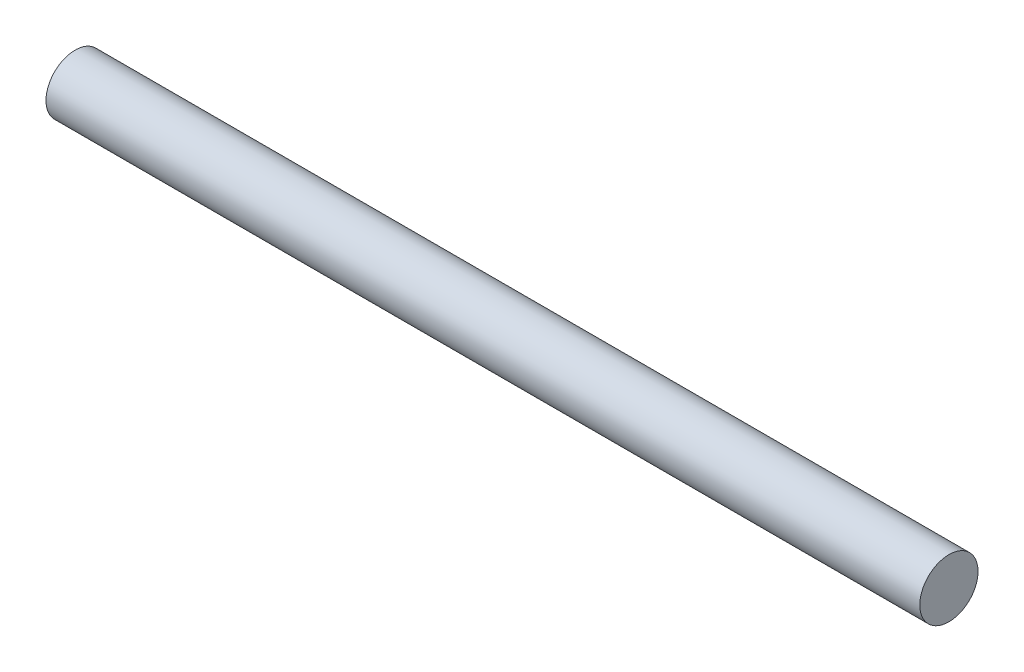
ISO-10303-21;
HEADER;
FILE_DESCRIPTION(('STEP AP214'),'2;1');
FILE_NAME('part.step','',(''),(''),'','','');
FILE_SCHEMA(('AUTOMOTIVE_DESIGN { 1 0 10303 214 1 1 1 1 }'));
ENDSEC;
DATA;
#1=APPLICATION_CONTEXT('core data for automotive mechanical design processes');
#2=APPLICATION_PROTOCOL_DEFINITION('international standard','automotive_design',2000,#1);
#3=PRODUCT_CONTEXT('',#1,'mechanical');
#4=PRODUCT('Part','Part','',(#3));
#5=PRODUCT_RELATED_PRODUCT_CATEGORY('part','',(#4));
#6=PRODUCT_DEFINITION_FORMATION('','',#4);
#7=PRODUCT_DEFINITION_CONTEXT('part definition',#1,'design');
#8=PRODUCT_DEFINITION('design','',#6,#7);
#9=PRODUCT_DEFINITION_SHAPE('','',#8);
#10=(LENGTH_UNIT() NAMED_UNIT(*) SI_UNIT(.MILLI.,.METRE.));
#11=(NAMED_UNIT(*) PLANE_ANGLE_UNIT() SI_UNIT($,.RADIAN.));
#12=(NAMED_UNIT(*) SI_UNIT($,.STERADIAN.) SOLID_ANGLE_UNIT());
#13=UNCERTAINTY_MEASURE_WITH_UNIT(LENGTH_MEASURE(1.E-05),#10,'distance_accuracy_value','');
#14=(GEOMETRIC_REPRESENTATION_CONTEXT(3) GLOBAL_UNCERTAINTY_ASSIGNED_CONTEXT((#13)) GLOBAL_UNIT_ASSIGNED_CONTEXT((#10,
#11,#12)) REPRESENTATION_CONTEXT('',''));
#15=CARTESIAN_POINT('',(0.,0.,0.));
#16=DIRECTION('',(0.,0.,1.));
#17=DIRECTION('',(1.,0.,0.));
#18=AXIS2_PLACEMENT_3D('',#15,#16,#17);
#19=CARTESIAN_POINT('',(90.,0.,0.));
#20=DIRECTION('',(-1.,0.,0.));
#21=DIRECTION('',(0.,0.,1.));
#22=AXIS2_PLACEMENT_3D('',#19,#20,#21);
#23=CYLINDRICAL_SURFACE('',#22,3.);
#24=CARTESIAN_POINT('',(90.,0.,0.));
#25=DIRECTION('',(1.,0.,0.));
#26=DIRECTION('',(0.,0.,-1.));
#27=AXIS2_PLACEMENT_3D('',#24,#25,#26);
#28=CIRCLE('',#27,3.);
#29=CARTESIAN_POINT('',(90.,0.,3.));
#30=VERTEX_POINT('',#29);
#31=EDGE_CURVE('E10',#30,#30,#28,.T.);
#32=CARTESIAN_POINT('',(0.,0.,0.));
#33=DIRECTION('',(1.,0.,0.));
#34=DIRECTION('',(0.,0.,-1.));
#35=AXIS2_PLACEMENT_3D('',#32,#33,#34);
#36=CIRCLE('',#35,3.);
#37=CARTESIAN_POINT('',(0.,0.,3.));
#38=VERTEX_POINT('',#37);
#39=EDGE_CURVE('E33',#38,#38,#36,.T.);
#40=CARTESIAN_POINT('',(90.,0.,3.));
#41=CARTESIAN_POINT('',(89.0625,0.,3.));
#42=CARTESIAN_POINT('',(88.125,0.,3.));
#43=CARTESIAN_POINT('',(86.25,0.,3.));
#44=CARTESIAN_POINT('',(85.3125,0.,3.));
#45=CARTESIAN_POINT('',(83.4375,0.,3.));
#46=CARTESIAN_POINT('',(82.5,0.,3.));
#47=CARTESIAN_POINT('',(80.625,0.,3.));
#48=CARTESIAN_POINT('',(79.6875,0.,3.));
#49=CARTESIAN_POINT('',(77.8125,0.,3.));
#50=CARTESIAN_POINT('',(76.875,0.,3.));
#51=CARTESIAN_POINT('',(75.,0.,3.));
#52=CARTESIAN_POINT('',(74.0625,0.,3.));
#53=CARTESIAN_POINT('',(72.1875,0.,3.));
#54=CARTESIAN_POINT('',(71.25,0.,3.));
#55=CARTESIAN_POINT('',(69.375,0.,3.));
#56=CARTESIAN_POINT('',(68.4375,0.,3.));
#57=CARTESIAN_POINT('',(66.5625,0.,3.));
#58=CARTESIAN_POINT('',(65.625,0.,3.));
#59=CARTESIAN_POINT('',(63.75,0.,3.));
#60=CARTESIAN_POINT('',(62.8125,0.,3.));
#61=CARTESIAN_POINT('',(60.9375,0.,3.));
#62=CARTESIAN_POINT('',(60.,0.,3.));
#63=CARTESIAN_POINT('',(58.125,0.,3.));
#64=CARTESIAN_POINT('',(57.1875,0.,3.));
#65=CARTESIAN_POINT('',(55.3125,0.,3.));
#66=CARTESIAN_POINT('',(54.375,0.,3.));
#67=CARTESIAN_POINT('',(52.5,0.,3.));
#68=CARTESIAN_POINT('',(51.5625,0.,3.));
#69=CARTESIAN_POINT('',(49.6875,0.,3.));
#70=CARTESIAN_POINT('',(48.75,0.,3.));
#71=CARTESIAN_POINT('',(46.875,0.,3.));
#72=CARTESIAN_POINT('',(45.9375,0.,3.));
#73=CARTESIAN_POINT('',(44.0625,0.,3.));
#74=CARTESIAN_POINT('',(43.125,0.,3.));
#75=CARTESIAN_POINT('',(41.25,0.,3.));
#76=CARTESIAN_POINT('',(40.3125,0.,3.));
#77=CARTESIAN_POINT('',(38.4375,0.,3.));
#78=CARTESIAN_POINT('',(37.5,0.,3.));
#79=CARTESIAN_POINT('',(35.625,0.,3.));
#80=CARTESIAN_POINT('',(34.6875,0.,3.));
#81=CARTESIAN_POINT('',(32.8125,0.,3.));
#82=CARTESIAN_POINT('',(31.875,0.,3.));
#83=CARTESIAN_POINT('',(30.,0.,3.));
#84=CARTESIAN_POINT('',(29.0625,0.,3.));
#85=CARTESIAN_POINT('',(27.1875,0.,3.));
#86=CARTESIAN_POINT('',(26.25,0.,3.));
#87=CARTESIAN_POINT('',(24.375,0.,3.));
#88=CARTESIAN_POINT('',(23.4375,0.,3.));
#89=CARTESIAN_POINT('',(21.5625,0.,3.));
#90=CARTESIAN_POINT('',(20.625,0.,3.));
#91=CARTESIAN_POINT('',(18.75,0.,3.));
#92=CARTESIAN_POINT('',(17.8125,0.,3.));
#93=CARTESIAN_POINT('',(15.9375,0.,3.));
#94=CARTESIAN_POINT('',(15.,0.,3.));
#95=CARTESIAN_POINT('',(13.125,0.,3.));
#96=CARTESIAN_POINT('',(12.1875,0.,3.));
#97=CARTESIAN_POINT('',(10.3125,0.,3.));
#98=CARTESIAN_POINT('',(9.37499999999999,0.,3.));
#99=CARTESIAN_POINT('',(7.49999999999999,0.,3.));
#100=CARTESIAN_POINT('',(6.56249999999999,0.,3.));
#101=CARTESIAN_POINT('',(4.68749999999999,0.,3.));
#102=CARTESIAN_POINT('',(3.74999999999998,0.,3.));
#103=CARTESIAN_POINT('',(1.87499999999998,0.,3.));
#104=CARTESIAN_POINT('',(0.937499999999986,0.,3.));
#105=CARTESIAN_POINT('',(0.,0.,3.));
#106=B_SPLINE_CURVE_WITH_KNOTS('',3,(#40,#41,#42,#43,#44,#45,#46,#47,#48,#49,#50,#51,#52,#53,
#54,#55,#56,#57,#58,#59,#60,#61,#62,#63,#64,#65,#66,#67,#68,#69,#70,#71,#72,#73,#74,#75,#76,#77,
#78,#79,#80,#81,#82,#83,#84,#85,#86,#87,#88,#89,#90,#91,#92,#93,#94,#95,#96,#97,#98,#99,#100,
#101,#102,#103,#104,#105),.UNSPECIFIED.,.F.,.F.,(4,2,2,2,2,2,2,2,2,2,2,2,2,2,2,2,2,2,2,2,2,2,2,
2,2,2,2,2,2,2,2,2,4),(0.,2.8125,5.62499999999999,8.43749999999999,11.25,14.0625,16.875,19.6875,
22.5,25.3125,28.125,30.9375,33.75,36.5625,39.375,42.1875,45.,47.8125,50.625,53.4375,56.25,
59.0625,61.875,64.6875,67.5,70.3125,73.125,75.9375,78.75,81.5625,84.375,87.1875,90.),.UNSPECIFIED.);
#107=EDGE_CURVE('BSEAM30',#30,#38,#106,.T.);
#108=ORIENTED_EDGE('',*,*,#31,.F.);
#109=ORIENTED_EDGE('',*,*,#39,.T.);
#110=ORIENTED_EDGE('',*,*,#107,.T.);
#111=ORIENTED_EDGE('',*,*,#107,.F.);
#112=EDGE_LOOP('',(#108,#110,#109,#111));
#113=FACE_BOUND('',#112,.T.);
#114=ADVANCED_FACE('F30',(#113),#23,.T.);
#115=CARTESIAN_POINT('',(90.,0.,0.));
#116=DIRECTION('',(1.,0.,0.));
#117=DIRECTION('',(0.,0.,-1.));
#118=AXIS2_PLACEMENT_3D('',#115,#116,#117);
#119=PLANE('',#118);
#120=ORIENTED_EDGE('',*,*,#31,.T.);
#121=EDGE_LOOP('',(#120));
#122=FACE_BOUND('',#121,.T.);
#123=ADVANCED_FACE('F45',(#122),#119,.T.);
#124=CARTESIAN_POINT('',(0.,0.,0.));
#125=DIRECTION('',(1.,0.,0.));
#126=DIRECTION('',(0.,0.,-1.));
#127=AXIS2_PLACEMENT_3D('',#124,#125,#126);
#128=PLANE('',#127);
#129=ORIENTED_EDGE('',*,*,#39,.F.);
#130=EDGE_LOOP('',(#129));
#131=FACE_BOUND('',#130,.T.);
#132=ADVANCED_FACE('F43',(#131),#128,.F.);
#133=CLOSED_SHELL('',(#114,#123,#132));
#134=MANIFOLD_SOLID_BREP('B2',#133);
#135=ADVANCED_BREP_SHAPE_REPRESENTATION('',(#18,#134),#14);
#136=SHAPE_DEFINITION_REPRESENTATION(#9,#135);
ENDSEC;
END-ISO-10303-21;
